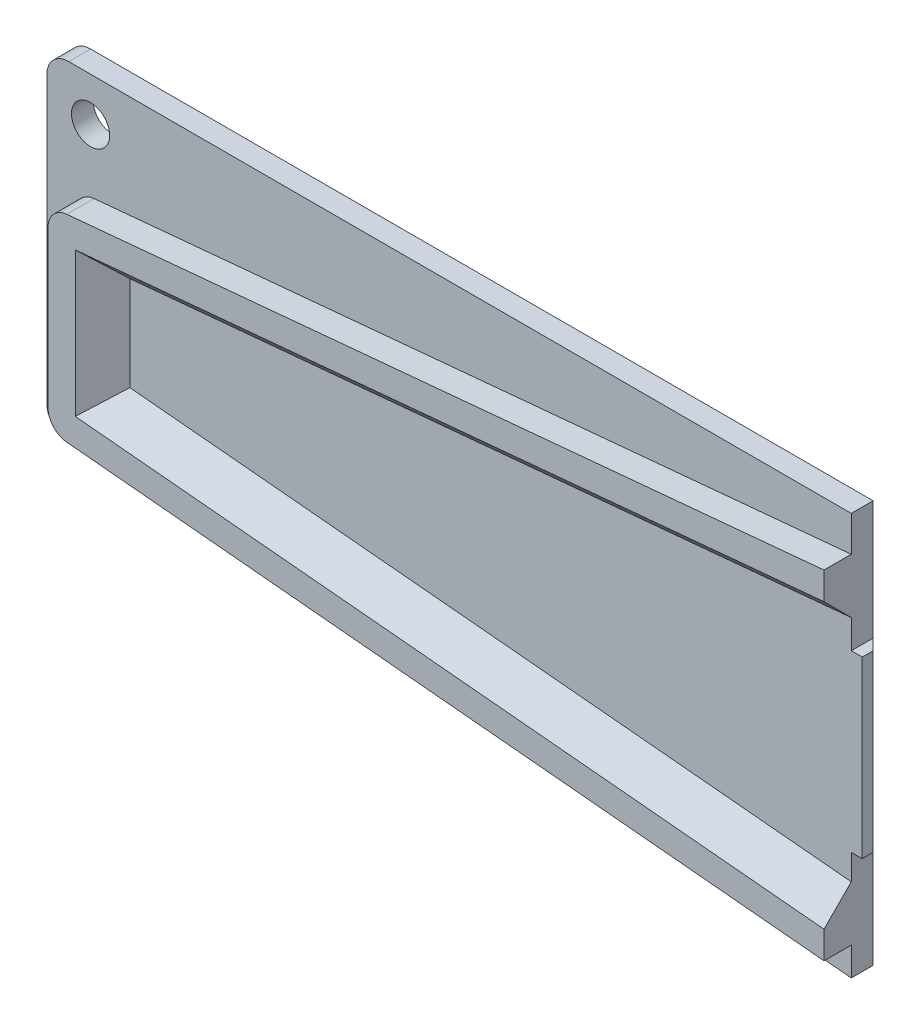
ISO-10303-21;
HEADER;
FILE_DESCRIPTION(('STEP AP214'),'2;1');
FILE_NAME('part.step','',(''),(''),'','','');
FILE_SCHEMA(('AUTOMOTIVE_DESIGN { 1 0 10303 214 1 1 1 1 }'));
ENDSEC;
DATA;
#1=APPLICATION_CONTEXT('core data for automotive mechanical design processes');
#2=APPLICATION_PROTOCOL_DEFINITION('international standard','automotive_design',2000,#1);
#3=PRODUCT_CONTEXT('',#1,'mechanical');
#4=PRODUCT('Part','Part','',(#3));
#5=PRODUCT_RELATED_PRODUCT_CATEGORY('part','',(#4));
#6=PRODUCT_DEFINITION_FORMATION('','',#4);
#7=PRODUCT_DEFINITION_CONTEXT('part definition',#1,'design');
#8=PRODUCT_DEFINITION('design','',#6,#7);
#9=PRODUCT_DEFINITION_SHAPE('','',#8);
#10=(LENGTH_UNIT() NAMED_UNIT(*) SI_UNIT(.MILLI.,.METRE.));
#11=(NAMED_UNIT(*) PLANE_ANGLE_UNIT() SI_UNIT($,.RADIAN.));
#12=(NAMED_UNIT(*) SI_UNIT($,.STERADIAN.) SOLID_ANGLE_UNIT());
#13=UNCERTAINTY_MEASURE_WITH_UNIT(LENGTH_MEASURE(1.E-05),#10,'distance_accuracy_value','');
#14=(GEOMETRIC_REPRESENTATION_CONTEXT(3) GLOBAL_UNCERTAINTY_ASSIGNED_CONTEXT((#13)) GLOBAL_UNIT_ASSIGNED_CONTEXT((#10,
#11,#12)) REPRESENTATION_CONTEXT('',''));
#15=CARTESIAN_POINT('',(0.,0.,0.));
#16=DIRECTION('',(0.,0.,1.));
#17=DIRECTION('',(1.,0.,0.));
#18=AXIS2_PLACEMENT_3D('',#15,#16,#17);
#19=CARTESIAN_POINT('',(-114.701591379437,-27.1776995517147,0.));
#20=DIRECTION('',(0.,0.,-1.));
#21=DIRECTION('',(1.,0.,0.));
#22=AXIS2_PLACEMENT_3D('',#19,#20,#21);
#23=PLANE('',#22);
#24=DIRECTION('',(0.,1.,0.));
#25=VECTOR('',#24,1.);
#26=CARTESIAN_POINT('',(-43.,-35.8676482876294,0.));
#27=LINE('',#26,#25);
#28=CARTESIAN_POINT('',(-43.,-28.2347247659633,0.));
#29=VERTEX_POINT('',#28);
#30=CARTESIAN_POINT('',(-43.0000000000001,-25.8996605862736,0.));
#31=VERTEX_POINT('',#30);
#32=EDGE_CURVE('E245',#29,#31,#27,.T.);
#33=ORIENTED_EDGE('',*,*,#32,.T.);
#34=DIRECTION('',(1.,0.,0.));
#35=VECTOR('',#34,1.);
#36=CARTESIAN_POINT('',(-43.0000000000001,-25.8996605862736,0.));
#37=LINE('',#36,#35);
#38=CARTESIAN_POINT('',(-42.,-25.8996605862736,0.));
#39=VERTEX_POINT('',#38);
#40=EDGE_CURVE('E411',#31,#39,#37,.T.);
#41=ORIENTED_EDGE('',*,*,#40,.T.);
#42=DIRECTION('',(0.,1.,0.));
#43=VECTOR('',#42,1.);
#44=CARTESIAN_POINT('',(-42.,-25.8996605862736,0.));
#45=LINE('',#44,#43);
#46=CARTESIAN_POINT('',(-42.0000000000001,-9.89966058627359,0.));
#47=VERTEX_POINT('',#46);
#48=EDGE_CURVE('E435',#39,#47,#45,.T.);
#49=ORIENTED_EDGE('',*,*,#48,.T.);
#50=DIRECTION('',(1.,0.,0.));
#51=VECTOR('',#50,1.);
#52=CARTESIAN_POINT('',(-43.0000000000001,-9.89966058627359,0.));
#53=LINE('',#52,#51);
#54=CARTESIAN_POINT('',(-43.,-9.89966058627359,0.));
#55=VERTEX_POINT('',#54);
#56=EDGE_CURVE('E388',#55,#47,#53,.T.);
#57=ORIENTED_EDGE('',*,*,#56,.F.);
#58=CARTESIAN_POINT('',(-43.,-7.26527523403666,0.));
#59=VERTEX_POINT('',#58);
#60=EDGE_CURVE('E250',#55,#59,#27,.T.);
#61=ORIENTED_EDGE('',*,*,#60,.T.);
#62=DIRECTION('',(0.995686643319218,0.0927798917638361,0.));
#63=VECTOR('',#62,1.);
#64=CARTESIAN_POINT('',(-42.7680502705904,-7.2436617365235,0.));
#65=LINE('',#64,#63);
#66=CARTESIAN_POINT('',(-109.100916052008,-13.4246787752465,0.));
#67=VERTEX_POINT('',#66);
#68=EDGE_CURVE('E251',#67,#59,#65,.T.);
#69=ORIENTED_EDGE('',*,*,#68,.F.);
#70=DIRECTION('',(0.,1.,0.));
#71=VECTOR('',#70,1.);
#72=CARTESIAN_POINT('',(-109.100916052008,-11.1468032148899,0.));
#73=LINE('',#72,#71);
#74=CARTESIAN_POINT('',(-109.100916052008,-22.0753212247535,0.));
#75=VERTEX_POINT('',#74);
#76=EDGE_CURVE('E313',#75,#67,#73,.T.);
#77=ORIENTED_EDGE('',*,*,#76,.F.);
#78=DIRECTION('',(-0.995686643319218,0.0927798917638361,0.));
#79=VECTOR('',#78,1.);
#80=CARTESIAN_POINT('',(-111.368966322599,-21.8639801768121,0.));
#81=LINE('',#80,#79);
#82=EDGE_CURVE('E316',#29,#75,#81,.T.);
#83=ORIENTED_EDGE('',*,*,#82,.F.);
#84=EDGE_LOOP('',(#33,#41,#49,#57,#61,#69,#77,#83));
#85=FACE_BOUND('',#84,.T.);
#86=ADVANCED_FACE('F35',(#85),#23,.F.);
#87=CARTESIAN_POINT('',(-112.701591379437,-3.00000000000001,0.));
#88=DIRECTION('',(0.,0.,-1.));
#89=DIRECTION('',(-1.,0.,0.));
#90=AXIS2_PLACEMENT_3D('',#87,#88,#89);
#91=CIRCLE('',#90,1.75);
#92=CARTESIAN_POINT('',(-114.451591379437,-3.00000000000001,0.));
#93=VERTEX_POINT('',#92);
#94=EDGE_CURVE('E205',#93,#93,#91,.T.);
#95=ORIENTED_EDGE('',*,*,#94,.T.);
#96=EDGE_LOOP('',(#95));
#97=FACE_BOUND('',#96,.T.);
#98=DIRECTION('',(-0.995686643319218,0.092779891763836,0.));
#99=VECTOR('',#98,1.);
#100=CARTESIAN_POINT('',(-43.,-33.2563849775857,0.));
#101=LINE('',#100,#99);
#102=CARTESIAN_POINT('',(-43.,-33.2563849775857,0.));
#103=VERTEX_POINT('',#102);
#104=CARTESIAN_POINT('',(-112.37719784636,-26.7916915419022,0.));
#105=VERTEX_POINT('',#104);
#106=EDGE_CURVE('E199',#103,#105,#101,.T.);
#107=ORIENTED_EDGE('',*,*,#106,.T.);
#108=CARTESIAN_POINT('',(-112.200916052008,-24.8998869195957,0.));
#109=DIRECTION('',(0.,0.,-1.));
#110=DIRECTION('',(-1.,0.,0.));
#111=AXIS2_PLACEMENT_3D('',#108,#109,#110);
#112=CIRCLE('',#111,1.9);
#113=CARTESIAN_POINT('',(-114.100916052008,-24.8998869195957,0.));
#114=VERTEX_POINT('',#113);
#115=EDGE_CURVE('E224',#105,#114,#112,.T.);
#116=ORIENTED_EDGE('',*,*,#115,.T.);
#117=DIRECTION('',(0.,1.,0.));
#118=VECTOR('',#117,1.);
#119=CARTESIAN_POINT('',(-114.100916052008,-24.8998869195957,0.));
#120=LINE('',#119,#118);
#121=CARTESIAN_POINT('',(-114.100916052008,-10.6001130804043,0.));
#122=VERTEX_POINT('',#121);
#123=EDGE_CURVE('E190',#114,#122,#120,.T.);
#124=ORIENTED_EDGE('',*,*,#123,.T.);
#125=CARTESIAN_POINT('',(-112.200916052008,-10.6001130804043,0.));
#126=DIRECTION('',(0.,0.,-1.));
#127=DIRECTION('',(-1.,0.,0.));
#128=AXIS2_PLACEMENT_3D('',#125,#126,#127);
#129=CIRCLE('',#128,1.9);
#130=CARTESIAN_POINT('',(-112.37719784636,-8.70830845809778,0.));
#131=VERTEX_POINT('',#130);
#132=EDGE_CURVE('E227',#122,#131,#129,.T.);
#133=ORIENTED_EDGE('',*,*,#132,.T.);
#134=DIRECTION('',(0.995686643319218,0.0927798917638362,0.));
#135=VECTOR('',#134,1.);
#136=CARTESIAN_POINT('',(-112.37719784636,-8.70830845809778,0.));
#137=LINE('',#136,#135);
#138=CARTESIAN_POINT('',(-43.,-2.24361502241426,0.));
#139=VERTEX_POINT('',#138);
#140=EDGE_CURVE('E202',#131,#139,#137,.T.);
#141=ORIENTED_EDGE('',*,*,#140,.T.);
#142=CARTESIAN_POINT('',(-43.,1.,0.));
#143=VERTEX_POINT('',#142);
#144=EDGE_CURVE('E268',#139,#143,#27,.T.);
#145=ORIENTED_EDGE('',*,*,#144,.T.);
#146=DIRECTION('',(-1.,0.,0.));
#147=VECTOR('',#146,1.);
#148=CARTESIAN_POINT('',(-43.,1.,0.));
#149=LINE('',#148,#147);
#150=CARTESIAN_POINT('',(-114.701591379437,0.999999999999987,0.));
#151=VERTEX_POINT('',#150);
#152=EDGE_CURVE('E258',#143,#151,#149,.T.);
#153=ORIENTED_EDGE('',*,*,#152,.T.);
#154=CARTESIAN_POINT('',(-114.701591379437,-1.00000000000001,0.));
#155=DIRECTION('',(0.,0.,1.));
#156=DIRECTION('',(1.,0.,0.));
#157=AXIS2_PLACEMENT_3D('',#154,#155,#156);
#158=CIRCLE('',#157,2.);
#159=CARTESIAN_POINT('',(-116.701591379437,-1.00000000000001,0.));
#160=VERTEX_POINT('',#159);
#161=EDGE_CURVE('E289',#151,#160,#158,.T.);
#162=ORIENTED_EDGE('',*,*,#161,.T.);
#163=DIRECTION('',(0.,-1.,0.));
#164=VECTOR('',#163,1.);
#165=CARTESIAN_POINT('',(-116.701591379437,-4.67769955171465,0.));
#166=LINE('',#165,#164);
#167=CARTESIAN_POINT('',(-116.701591379437,-27.1776995517147,0.));
#168=VERTEX_POINT('',#167);
#169=EDGE_CURVE('E292',#160,#168,#166,.T.);
#170=ORIENTED_EDGE('',*,*,#169,.T.);
#171=CARTESIAN_POINT('',(-114.701591379437,-27.1776995517147,0.));
#172=DIRECTION('',(0.,0.,1.));
#173=DIRECTION('',(1.,0.,0.));
#174=AXIS2_PLACEMENT_3D('',#171,#172,#173);
#175=CIRCLE('',#174,2.00000000000001);
#176=CARTESIAN_POINT('',(-114.887151162965,-29.1690728383531,0.));
#177=VERTEX_POINT('',#176);
#178=EDGE_CURVE('E437',#168,#177,#175,.T.);
#179=ORIENTED_EDGE('',*,*,#178,.T.);
#180=DIRECTION('',(0.995686643319217,-0.0927798917638361,0.));
#181=VECTOR('',#180,1.);
#182=CARTESIAN_POINT('',(-114.887151162965,-29.1690728383531,0.));
#183=LINE('',#182,#181);
#184=CARTESIAN_POINT('',(-43.,-35.8676482876294,0.));
#185=VERTEX_POINT('',#184);
#186=EDGE_CURVE('E256',#177,#185,#183,.T.);
#187=ORIENTED_EDGE('',*,*,#186,.T.);
#188=EDGE_CURVE('E249',#185,#103,#27,.T.);
#189=ORIENTED_EDGE('',*,*,#188,.T.);
#190=EDGE_LOOP('',(#107,#116,#124,#133,#141,#145,#153,#162,#170,#179,#187,#189));
#191=FACE_BOUND('',#190,.T.);
#192=ADVANCED_FACE('F283',(#97,#191),#23,.F.);
#193=CARTESIAN_POINT('',(-43.,-35.8676482876294,-2.));
#194=DIRECTION('',(-1.,0.,0.));
#195=DIRECTION('',(0.,0.,-1.));
#196=AXIS2_PLACEMENT_3D('',#193,#194,#195);
#197=PLANE('',#196);
#198=DIRECTION('',(0.,0.,1.));
#199=VECTOR('',#198,1.);
#200=CARTESIAN_POINT('',(-43.,-25.8996605862736,-2.));
#201=LINE('',#200,#199);
#202=CARTESIAN_POINT('',(-43.,-25.8996605862736,-2.));
#203=VERTEX_POINT('',#202);
#204=EDGE_CURVE('E408',#203,#31,#201,.T.);
#205=ORIENTED_EDGE('',*,*,#204,.T.);
#206=ORIENTED_EDGE('',*,*,#32,.F.);
#207=DIRECTION('',(0.,-0.708633423963613,0.705576835250142));
#208=VECTOR('',#207,1.);
#209=CARTESIAN_POINT('',(-43.,-31.0676931327552,2.82074876376061));
#210=LINE('',#209,#208);
#211=CARTESIAN_POINT('',(-43.,-30.7455548717745,2.5));
#212=VERTEX_POINT('',#211);
#213=EDGE_CURVE('E44',#212,#29,#210,.F.);
#214=ORIENTED_EDGE('',*,*,#213,.F.);
#215=DIRECTION('',(0.,-1.,0.));
#216=VECTOR('',#215,1.);
#217=CARTESIAN_POINT('',(-43.,-30.7455548717745,2.5));
#218=LINE('',#217,#216);
#219=CARTESIAN_POINT('',(-43.,-33.2563849775857,2.5));
#220=VERTEX_POINT('',#219);
#221=EDGE_CURVE('E219',#212,#220,#218,.T.);
#222=ORIENTED_EDGE('',*,*,#221,.T.);
#223=DIRECTION('',(0.,0.,-1.));
#224=VECTOR('',#223,1.);
#225=CARTESIAN_POINT('',(-43.,-33.2563849775857,2.5));
#226=LINE('',#225,#224);
#227=EDGE_CURVE('E242',#220,#103,#226,.T.);
#228=ORIENTED_EDGE('',*,*,#227,.T.);
#229=ORIENTED_EDGE('',*,*,#188,.F.);
#230=DIRECTION('',(0.,0.,1.));
#231=VECTOR('',#230,1.);
#232=CARTESIAN_POINT('',(-43.,-35.8676482876294,-2.));
#233=LINE('',#232,#231);
#234=CARTESIAN_POINT('',(-43.,-35.8676482876294,-2.));
#235=VERTEX_POINT('',#234);
#236=EDGE_CURVE('E305',#235,#185,#233,.T.);
#237=ORIENTED_EDGE('',*,*,#236,.F.);
#238=DIRECTION('',(0.,1.,0.));
#239=VECTOR('',#238,1.);
#240=CARTESIAN_POINT('',(-43.,-35.8676482876294,-2.));
#241=LINE('',#240,#239);
#242=EDGE_CURVE('E451',#235,#203,#241,.T.);
#243=ORIENTED_EDGE('',*,*,#242,.T.);
#244=EDGE_LOOP('',(#205,#206,#214,#222,#228,#229,#237,#243));
#245=FACE_BOUND('',#244,.T.);
#246=ADVANCED_FACE('F346',(#245),#197,.F.);
#247=CARTESIAN_POINT('',(-114.701591379437,-27.1776995517147,-2.));
#248=DIRECTION('',(0.,0.,1.));
#249=DIRECTION('',(-1.,0.,0.));
#250=AXIS2_PLACEMENT_3D('',#247,#248,#249);
#251=CYLINDRICAL_SURFACE('',#250,2.00000000000001);
#252=ORIENTED_EDGE('',*,*,#178,.F.);
#253=DIRECTION('',(0.,0.,1.));
#254=VECTOR('',#253,1.);
#255=CARTESIAN_POINT('',(-116.701591379437,-27.1776995517147,-2.));
#256=LINE('',#255,#254);
#257=CARTESIAN_POINT('',(-116.701591379437,-27.1776995517147,-2.));
#258=VERTEX_POINT('',#257);
#259=EDGE_CURVE('E308',#258,#168,#256,.T.);
#260=ORIENTED_EDGE('',*,*,#259,.F.);
#261=CARTESIAN_POINT('',(-114.701591379437,-27.1776995517147,-2.));
#262=DIRECTION('',(0.,0.,1.));
#263=DIRECTION('',(1.,0.,0.));
#264=AXIS2_PLACEMENT_3D('',#261,#262,#263);
#265=CIRCLE('',#264,2.00000000000001);
#266=CARTESIAN_POINT('',(-114.887151162965,-29.1690728383531,-2.));
#267=VERTEX_POINT('',#266);
#268=EDGE_CURVE('E439',#258,#267,#265,.T.);
#269=ORIENTED_EDGE('',*,*,#268,.T.);
#270=DIRECTION('',(0.,0.,1.));
#271=VECTOR('',#270,1.);
#272=CARTESIAN_POINT('',(-114.887151162965,-29.1690728383531,-2.));
#273=LINE('',#272,#271);
#274=EDGE_CURVE('E307',#267,#177,#273,.T.);
#275=ORIENTED_EDGE('',*,*,#274,.T.);
#276=EDGE_LOOP('',(#252,#260,#269,#275));
#277=FACE_BOUND('',#276,.T.);
#278=ADVANCED_FACE('F369',(#277),#251,.T.);
#279=CARTESIAN_POINT('',(-114.887151162965,-29.1690728383531,-2.));
#280=DIRECTION('',(0.0927798917638361,0.995686643319218,0.));
#281=DIRECTION('',(-0.995686643319218,0.0927798917638361,0.));
#282=AXIS2_PLACEMENT_3D('',#279,#280,#281);
#283=PLANE('',#282);
#284=ORIENTED_EDGE('',*,*,#186,.F.);
#285=ORIENTED_EDGE('',*,*,#274,.F.);
#286=DIRECTION('',(0.995686643319217,-0.0927798917638361,0.));
#287=VECTOR('',#286,1.);
#288=CARTESIAN_POINT('',(-114.887151162965,-29.1690728383531,-2.));
#289=LINE('',#288,#287);
#290=EDGE_CURVE('E442',#267,#235,#289,.T.);
#291=ORIENTED_EDGE('',*,*,#290,.T.);
#292=ORIENTED_EDGE('',*,*,#236,.T.);
#293=EDGE_LOOP('',(#284,#285,#291,#292));
#294=FACE_BOUND('',#293,.T.);
#295=ADVANCED_FACE('F365',(#294),#283,.F.);
#296=CARTESIAN_POINT('',(-43.,-9.89966058627359,-2.));
#297=VERTEX_POINT('',#296);
#298=CARTESIAN_POINT('',(-43.,1.,-2.));
#299=VERTEX_POINT('',#298);
#300=EDGE_CURVE('E444',#297,#299,#241,.T.);
#301=ORIENTED_EDGE('',*,*,#300,.T.);
#302=DIRECTION('',(0.,0.,1.));
#303=VECTOR('',#302,1.);
#304=CARTESIAN_POINT('',(-43.,1.,-2.));
#305=LINE('',#304,#303);
#306=EDGE_CURVE('E303',#299,#143,#305,.T.);
#307=ORIENTED_EDGE('',*,*,#306,.T.);
#308=ORIENTED_EDGE('',*,*,#144,.F.);
#309=DIRECTION('',(0.,0.,-1.));
#310=VECTOR('',#309,1.);
#311=CARTESIAN_POINT('',(-43.,-2.24361502241427,2.5));
#312=LINE('',#311,#310);
#313=CARTESIAN_POINT('',(-43.,-2.24361502241427,2.5));
#314=VERTEX_POINT('',#313);
#315=EDGE_CURVE('E239',#314,#139,#312,.T.);
#316=ORIENTED_EDGE('',*,*,#315,.F.);
#317=DIRECTION('',(0.,-1.,0.));
#318=VECTOR('',#317,1.);
#319=CARTESIAN_POINT('',(-43.,-2.24361502241427,2.5));
#320=LINE('',#319,#318);
#321=CARTESIAN_POINT('',(-43.,-4.75444512822548,2.5));
#322=VERTEX_POINT('',#321);
#323=EDGE_CURVE('E210',#314,#322,#320,.T.);
#324=ORIENTED_EDGE('',*,*,#323,.T.);
#325=DIRECTION('',(0.,-0.708633423963612,-0.705576835250143));
#326=VECTOR('',#325,1.);
#327=CARTESIAN_POINT('',(-43.,-22.6282715724193,-15.2967302554899));
#328=LINE('',#327,#326);
#329=EDGE_CURVE('E11',#59,#322,#328,.F.);
#330=ORIENTED_EDGE('',*,*,#329,.F.);
#331=ORIENTED_EDGE('',*,*,#60,.F.);
#332=DIRECTION('',(0.,0.,1.));
#333=VECTOR('',#332,1.);
#334=CARTESIAN_POINT('',(-43.0000000000001,-9.89966058627359,-2.));
#335=LINE('',#334,#333);
#336=EDGE_CURVE('E194',#297,#55,#335,.T.);
#337=ORIENTED_EDGE('',*,*,#336,.F.);
#338=EDGE_LOOP('',(#301,#307,#308,#316,#324,#330,#331,#337));
#339=FACE_BOUND('',#338,.T.);
#340=ADVANCED_FACE('F361',(#339),#197,.F.);
#341=CARTESIAN_POINT('',(-43.,1.,-2.));
#342=DIRECTION('',(0.,-1.,0.));
#343=DIRECTION('',(1.,0.,0.));
#344=AXIS2_PLACEMENT_3D('',#341,#342,#343);
#345=PLANE('',#344);
#346=ORIENTED_EDGE('',*,*,#152,.F.);
#347=ORIENTED_EDGE('',*,*,#306,.F.);
#348=DIRECTION('',(-1.,0.,0.));
#349=VECTOR('',#348,1.);
#350=CARTESIAN_POINT('',(-43.,1.,-2.));
#351=LINE('',#350,#349);
#352=CARTESIAN_POINT('',(-114.701591379437,0.999999999999987,-2.));
#353=VERTEX_POINT('',#352);
#354=EDGE_CURVE('E447',#299,#353,#351,.T.);
#355=ORIENTED_EDGE('',*,*,#354,.T.);
#356=DIRECTION('',(0.,0.,1.));
#357=VECTOR('',#356,1.);
#358=CARTESIAN_POINT('',(-114.701591379437,0.999999999999987,-2.));
#359=LINE('',#358,#357);
#360=EDGE_CURVE('E300',#353,#151,#359,.T.);
#361=ORIENTED_EDGE('',*,*,#360,.T.);
#362=EDGE_LOOP('',(#346,#347,#355,#361));
#363=FACE_BOUND('',#362,.T.);
#364=ADVANCED_FACE('F357',(#363),#345,.F.);
#365=CARTESIAN_POINT('',(-114.701591379437,-1.00000000000001,-2.));
#366=DIRECTION('',(0.,0.,1.));
#367=DIRECTION('',(-1.,0.,0.));
#368=AXIS2_PLACEMENT_3D('',#365,#366,#367);
#369=CYLINDRICAL_SURFACE('',#368,2.);
#370=ORIENTED_EDGE('',*,*,#161,.F.);
#371=ORIENTED_EDGE('',*,*,#360,.F.);
#372=CARTESIAN_POINT('',(-114.701591379437,-1.00000000000001,-2.));
#373=DIRECTION('',(0.,0.,1.));
#374=DIRECTION('',(1.,0.,0.));
#375=AXIS2_PLACEMENT_3D('',#372,#373,#374);
#376=CIRCLE('',#375,2.);
#377=CARTESIAN_POINT('',(-116.701591379437,-1.00000000000001,-2.));
#378=VERTEX_POINT('',#377);
#379=EDGE_CURVE('E301',#353,#378,#376,.T.);
#380=ORIENTED_EDGE('',*,*,#379,.T.);
#381=DIRECTION('',(0.,0.,1.));
#382=VECTOR('',#381,1.);
#383=CARTESIAN_POINT('',(-116.701591379437,-1.00000000000001,-2.));
#384=LINE('',#383,#382);
#385=EDGE_CURVE('E298',#378,#160,#384,.T.);
#386=ORIENTED_EDGE('',*,*,#385,.T.);
#387=EDGE_LOOP('',(#370,#371,#380,#386));
#388=FACE_BOUND('',#387,.T.);
#389=ADVANCED_FACE('F354',(#388),#369,.T.);
#390=CARTESIAN_POINT('',(-116.701591379437,-4.67769955171465,-2.));
#391=DIRECTION('',(1.,0.,0.));
#392=DIRECTION('',(0.,0.,1.));
#393=AXIS2_PLACEMENT_3D('',#390,#391,#392);
#394=PLANE('',#393);
#395=ORIENTED_EDGE('',*,*,#169,.F.);
#396=ORIENTED_EDGE('',*,*,#385,.F.);
#397=DIRECTION('',(0.,-1.,0.));
#398=VECTOR('',#397,1.);
#399=CARTESIAN_POINT('',(-116.701591379437,-4.67769955171465,-2.));
#400=LINE('',#399,#398);
#401=EDGE_CURVE('E295',#378,#258,#400,.T.);
#402=ORIENTED_EDGE('',*,*,#401,.T.);
#403=ORIENTED_EDGE('',*,*,#259,.T.);
#404=EDGE_LOOP('',(#395,#396,#402,#403));
#405=FACE_BOUND('',#404,.T.);
#406=ADVANCED_FACE('F351',(#405),#394,.F.);
#407=CARTESIAN_POINT('',(-114.701591379437,-27.1776995517147,-2.));
#408=DIRECTION('',(0.,0.,-1.));
#409=DIRECTION('',(1.,0.,0.));
#410=AXIS2_PLACEMENT_3D('',#407,#408,#409);
#411=PLANE('',#410);
#412=CARTESIAN_POINT('',(-112.701591379437,-3.00000000000001,-2.));
#413=DIRECTION('',(0.,0.,1.));
#414=DIRECTION('',(1.,0.,0.));
#415=AXIS2_PLACEMENT_3D('',#412,#413,#414);
#416=CIRCLE('',#415,1.75);
#417=CARTESIAN_POINT('',(-110.951591379437,-3.00000000000001,-2.));
#418=VERTEX_POINT('',#417);
#419=EDGE_CURVE('E39',#418,#418,#416,.T.);
#420=ORIENTED_EDGE('',*,*,#419,.T.);
#421=EDGE_LOOP('',(#420));
#422=FACE_BOUND('',#421,.T.);
#423=ORIENTED_EDGE('',*,*,#401,.F.);
#424=ORIENTED_EDGE('',*,*,#379,.F.);
#425=ORIENTED_EDGE('',*,*,#354,.F.);
#426=ORIENTED_EDGE('',*,*,#300,.F.);
#427=DIRECTION('',(0.,1.,0.));
#428=VECTOR('',#427,1.);
#429=CARTESIAN_POINT('',(-43.,-25.8996605862736,-2.));
#430=LINE('',#429,#428);
#431=EDGE_CURVE('E417',#203,#297,#430,.T.);
#432=ORIENTED_EDGE('',*,*,#431,.F.);
#433=ORIENTED_EDGE('',*,*,#242,.F.);
#434=ORIENTED_EDGE('',*,*,#290,.F.);
#435=ORIENTED_EDGE('',*,*,#268,.F.);
#436=EDGE_LOOP('',(#423,#424,#425,#426,#432,#433,#434,#435));
#437=FACE_BOUND('',#436,.T.);
#438=ADVANCED_FACE('F349',(#422,#437),#411,.T.);
#439=CARTESIAN_POINT('',(-42.,-25.8996605862736,-1.));
#440=DIRECTION('',(-1.,0.,0.));
#441=DIRECTION('',(0.,-1.,0.));
#442=AXIS2_PLACEMENT_3D('',#439,#440,#441);
#443=PLANE('',#442);
#444=DIRECTION('',(0.,0.,-1.));
#445=VECTOR('',#444,1.);
#446=CARTESIAN_POINT('',(-42.0000000000001,-9.89966058627359,-1.));
#447=LINE('',#446,#445);
#448=CARTESIAN_POINT('',(-42.0000000000001,-9.89966058627359,-1.));
#449=VERTEX_POINT('',#448);
#450=EDGE_CURVE('E426',#47,#449,#447,.T.);
#451=ORIENTED_EDGE('',*,*,#450,.F.);
#452=ORIENTED_EDGE('',*,*,#48,.F.);
#453=DIRECTION('',(0.,0.,-1.));
#454=VECTOR('',#453,1.);
#455=CARTESIAN_POINT('',(-42.,-25.8996605862736,-1.));
#456=LINE('',#455,#454);
#457=CARTESIAN_POINT('',(-42.,-25.8996605862736,-1.));
#458=VERTEX_POINT('',#457);
#459=EDGE_CURVE('E405',#39,#458,#456,.T.);
#460=ORIENTED_EDGE('',*,*,#459,.T.);
#461=DIRECTION('',(0.,1.,0.));
#462=VECTOR('',#461,1.);
#463=CARTESIAN_POINT('',(-42.,-25.8996605862736,-1.));
#464=LINE('',#463,#462);
#465=EDGE_CURVE('E422',#458,#449,#464,.T.);
#466=ORIENTED_EDGE('',*,*,#465,.T.);
#467=EDGE_LOOP('',(#451,#452,#460,#466));
#468=FACE_BOUND('',#467,.T.);
#469=ADVANCED_FACE('F500',(#468),#443,.F.);
#470=CARTESIAN_POINT('',(-42.,-25.8996605862736,-1.));
#471=DIRECTION('',(-0.707106781186547,0.,0.707106781186548));
#472=DIRECTION('',(-0.707106781186548,0.,-0.707106781186547));
#473=AXIS2_PLACEMENT_3D('',#470,#471,#472);
#474=PLANE('',#473);
#475=DIRECTION('',(-0.707106781186548,0.,-0.707106781186547));
#476=VECTOR('',#475,1.);
#477=CARTESIAN_POINT('',(-42.0000000000001,-9.89966058627359,-1.));
#478=LINE('',#477,#476);
#479=EDGE_CURVE('E412',#449,#297,#478,.T.);
#480=ORIENTED_EDGE('',*,*,#479,.F.);
#481=ORIENTED_EDGE('',*,*,#465,.F.);
#482=DIRECTION('',(-0.707106781186548,0.,-0.707106781186547));
#483=VECTOR('',#482,1.);
#484=CARTESIAN_POINT('',(-42.,-25.8996605862736,-1.));
#485=LINE('',#484,#483);
#486=EDGE_CURVE('E415',#458,#203,#485,.T.);
#487=ORIENTED_EDGE('',*,*,#486,.T.);
#488=ORIENTED_EDGE('',*,*,#431,.T.);
#489=EDGE_LOOP('',(#480,#481,#487,#488));
#490=FACE_BOUND('',#489,.T.);
#491=ADVANCED_FACE('F506',(#490),#474,.F.);
#492=CARTESIAN_POINT('',(0.,-25.8996605862734,0.));
#493=DIRECTION('',(0.,-1.,0.));
#494=DIRECTION('',(1.,0.,0.));
#495=AXIS2_PLACEMENT_3D('',#492,#493,#494);
#496=PLANE('',#495);
#497=ORIENTED_EDGE('',*,*,#204,.F.);
#498=ORIENTED_EDGE('',*,*,#486,.F.);
#499=ORIENTED_EDGE('',*,*,#459,.F.);
#500=ORIENTED_EDGE('',*,*,#40,.F.);
#501=EDGE_LOOP('',(#497,#498,#499,#500));
#502=FACE_BOUND('',#501,.T.);
#503=ADVANCED_FACE('F513',(#502),#496,.T.);
#504=CARTESIAN_POINT('',(0.,-9.89966058627344,0.));
#505=DIRECTION('',(0.,-1.,0.));
#506=DIRECTION('',(1.,0.,0.));
#507=AXIS2_PLACEMENT_3D('',#504,#505,#506);
#508=PLANE('',#507);
#509=ORIENTED_EDGE('',*,*,#336,.T.);
#510=ORIENTED_EDGE('',*,*,#56,.T.);
#511=ORIENTED_EDGE('',*,*,#450,.T.);
#512=ORIENTED_EDGE('',*,*,#479,.T.);
#513=EDGE_LOOP('',(#509,#510,#511,#512));
#514=FACE_BOUND('',#513,.T.);
#515=ADVANCED_FACE('F521',(#514),#508,.F.);
#516=CARTESIAN_POINT('',(-112.200916052008,-24.8998869195957,2.5));
#517=DIRECTION('',(0.,0.,-1.));
#518=DIRECTION('',(1.,0.,0.));
#519=AXIS2_PLACEMENT_3D('',#516,#517,#518);
#520=CYLINDRICAL_SURFACE('',#519,1.9);
#521=ORIENTED_EDGE('',*,*,#115,.F.);
#522=DIRECTION('',(0.,0.,-1.));
#523=VECTOR('',#522,1.);
#524=CARTESIAN_POINT('',(-112.37719784636,-26.7916915419022,2.5));
#525=LINE('',#524,#523);
#526=CARTESIAN_POINT('',(-112.37719784636,-26.7916915419022,2.5));
#527=VERTEX_POINT('',#526);
#528=EDGE_CURVE('E198',#527,#105,#525,.T.);
#529=ORIENTED_EDGE('',*,*,#528,.F.);
#530=CARTESIAN_POINT('',(-112.200916052008,-24.8998869195957,2.5));
#531=DIRECTION('',(0.,0.,-1.));
#532=DIRECTION('',(-1.,0.,0.));
#533=AXIS2_PLACEMENT_3D('',#530,#531,#532);
#534=CIRCLE('',#533,1.9);
#535=CARTESIAN_POINT('',(-114.100916052008,-24.8998869195957,2.5));
#536=VERTEX_POINT('',#535);
#537=EDGE_CURVE('E179',#527,#536,#534,.T.);
#538=ORIENTED_EDGE('',*,*,#537,.T.);
#539=DIRECTION('',(0.,0.,-1.));
#540=VECTOR('',#539,1.);
#541=CARTESIAN_POINT('',(-114.100916052008,-24.8998869195957,2.5));
#542=LINE('',#541,#540);
#543=EDGE_CURVE('E187',#536,#114,#542,.T.);
#544=ORIENTED_EDGE('',*,*,#543,.T.);
#545=EDGE_LOOP('',(#521,#529,#538,#544));
#546=FACE_BOUND('',#545,.T.);
#547=ADVANCED_FACE('F197',(#546),#520,.T.);
#548=CARTESIAN_POINT('',(-114.100916052008,-24.8998869195957,2.5));
#549=DIRECTION('',(1.,0.,0.));
#550=DIRECTION('',(0.,0.,1.));
#551=AXIS2_PLACEMENT_3D('',#548,#549,#550);
#552=PLANE('',#551);
#553=ORIENTED_EDGE('',*,*,#123,.F.);
#554=ORIENTED_EDGE('',*,*,#543,.F.);
#555=DIRECTION('',(0.,1.,0.));
#556=VECTOR('',#555,1.);
#557=CARTESIAN_POINT('',(-114.100916052008,-24.8998869195957,2.5));
#558=LINE('',#557,#556);
#559=CARTESIAN_POINT('',(-114.100916052008,-10.6001130804043,2.5));
#560=VERTEX_POINT('',#559);
#561=EDGE_CURVE('E175',#536,#560,#558,.T.);
#562=ORIENTED_EDGE('',*,*,#561,.T.);
#563=DIRECTION('',(0.,0.,-1.));
#564=VECTOR('',#563,1.);
#565=CARTESIAN_POINT('',(-114.100916052008,-10.6001130804043,2.5));
#566=LINE('',#565,#564);
#567=EDGE_CURVE('E195',#560,#122,#566,.T.);
#568=ORIENTED_EDGE('',*,*,#567,.T.);
#569=EDGE_LOOP('',(#553,#554,#562,#568));
#570=FACE_BOUND('',#569,.T.);
#571=ADVANCED_FACE('F188',(#570),#552,.F.);
#572=CARTESIAN_POINT('',(-112.200916052008,-10.6001130804043,2.5));
#573=DIRECTION('',(0.,0.,-1.));
#574=DIRECTION('',(1.,0.,0.));
#575=AXIS2_PLACEMENT_3D('',#572,#573,#574);
#576=CYLINDRICAL_SURFACE('',#575,1.9);
#577=ORIENTED_EDGE('',*,*,#132,.F.);
#578=ORIENTED_EDGE('',*,*,#567,.F.);
#579=CARTESIAN_POINT('',(-112.200916052008,-10.6001130804043,2.5));
#580=DIRECTION('',(0.,0.,-1.));
#581=DIRECTION('',(-1.,0.,0.));
#582=AXIS2_PLACEMENT_3D('',#579,#580,#581);
#583=CIRCLE('',#582,1.9);
#584=CARTESIAN_POINT('',(-112.37719784636,-8.70830845809778,2.5));
#585=VERTEX_POINT('',#584);
#586=EDGE_CURVE('E182',#560,#585,#583,.T.);
#587=ORIENTED_EDGE('',*,*,#586,.T.);
#588=DIRECTION('',(0.,0.,-1.));
#589=VECTOR('',#588,1.);
#590=CARTESIAN_POINT('',(-112.37719784636,-8.70830845809778,2.5));
#591=LINE('',#590,#589);
#592=EDGE_CURVE('E241',#585,#131,#591,.T.);
#593=ORIENTED_EDGE('',*,*,#592,.T.);
#594=EDGE_LOOP('',(#577,#578,#587,#593));
#595=FACE_BOUND('',#594,.T.);
#596=ADVANCED_FACE('F400',(#595),#576,.T.);
#597=CARTESIAN_POINT('',(-112.37719784636,-8.70830845809778,2.5));
#598=DIRECTION('',(0.0927798917638362,-0.995686643319218,0.));
#599=DIRECTION('',(0.995686643319218,0.0927798917638362,0.));
#600=AXIS2_PLACEMENT_3D('',#597,#598,#599);
#601=PLANE('',#600);
#602=ORIENTED_EDGE('',*,*,#140,.F.);
#603=ORIENTED_EDGE('',*,*,#592,.F.);
#604=DIRECTION('',(0.995686643319218,0.0927798917638362,0.));
#605=VECTOR('',#604,1.);
#606=CARTESIAN_POINT('',(-112.37719784636,-8.70830845809778,2.5));
#607=LINE('',#606,#605);
#608=EDGE_CURVE('E208',#585,#314,#607,.T.);
#609=ORIENTED_EDGE('',*,*,#608,.T.);
#610=ORIENTED_EDGE('',*,*,#315,.T.);
#611=EDGE_LOOP('',(#602,#603,#609,#610));
#612=FACE_BOUND('',#611,.T.);
#613=ADVANCED_FACE('F397',(#612),#601,.F.);
#614=CARTESIAN_POINT('',(-43.,-33.2563849775857,2.5));
#615=DIRECTION('',(0.092779891763836,0.995686643319218,0.));
#616=DIRECTION('',(-0.995686643319218,0.092779891763836,0.));
#617=AXIS2_PLACEMENT_3D('',#614,#615,#616);
#618=PLANE('',#617);
#619=ORIENTED_EDGE('',*,*,#106,.F.);
#620=ORIENTED_EDGE('',*,*,#227,.F.);
#621=DIRECTION('',(-0.995686643319218,0.092779891763836,0.));
#622=VECTOR('',#621,1.);
#623=CARTESIAN_POINT('',(-43.,-33.2563849775857,2.5));
#624=LINE('',#623,#622);
#625=EDGE_CURVE('E222',#220,#527,#624,.T.);
#626=ORIENTED_EDGE('',*,*,#625,.T.);
#627=ORIENTED_EDGE('',*,*,#528,.T.);
#628=EDGE_LOOP('',(#619,#620,#626,#627));
#629=FACE_BOUND('',#628,.T.);
#630=ADVANCED_FACE('F281',(#629),#618,.F.);
#631=CARTESIAN_POINT('',(-112.200916052008,-24.8998869195957,2.5));
#632=DIRECTION('',(0.,0.,1.));
#633=DIRECTION('',(-1.,0.,0.));
#634=AXIS2_PLACEMENT_3D('',#631,#632,#633);
#635=PLANE('',#634);
#636=ORIENTED_EDGE('',*,*,#537,.F.);
#637=ORIENTED_EDGE('',*,*,#625,.F.);
#638=ORIENTED_EDGE('',*,*,#221,.F.);
#639=DIRECTION('',(0.995686643319218,-0.0927798917638361,0.));
#640=VECTOR('',#639,1.);
#641=CARTESIAN_POINT('',(-43.,-30.7455548717745,2.5));
#642=LINE('',#641,#640);
#643=CARTESIAN_POINT('',(-111.600916052008,-24.3531967851101,2.5));
#644=VERTEX_POINT('',#643);
#645=EDGE_CURVE('E217',#644,#212,#642,.T.);
#646=ORIENTED_EDGE('',*,*,#645,.F.);
#647=DIRECTION('',(0.,-1.,0.));
#648=VECTOR('',#647,1.);
#649=CARTESIAN_POINT('',(-111.600916052008,-24.3531967851101,2.5));
#650=LINE('',#649,#648);
#651=CARTESIAN_POINT('',(-111.600916052008,-11.1468032148899,2.5));
#652=VERTEX_POINT('',#651);
#653=EDGE_CURVE('E215',#652,#644,#650,.T.);
#654=ORIENTED_EDGE('',*,*,#653,.F.);
#655=DIRECTION('',(-0.995686643319218,-0.0927798917638361,0.));
#656=VECTOR('',#655,1.);
#657=CARTESIAN_POINT('',(-111.600916052008,-11.1468032148899,2.5));
#658=LINE('',#657,#656);
#659=EDGE_CURVE('E213',#322,#652,#658,.T.);
#660=ORIENTED_EDGE('',*,*,#659,.F.);
#661=ORIENTED_EDGE('',*,*,#323,.F.);
#662=ORIENTED_EDGE('',*,*,#608,.F.);
#663=ORIENTED_EDGE('',*,*,#586,.F.);
#664=ORIENTED_EDGE('',*,*,#561,.F.);
#665=EDGE_LOOP('',(#636,#637,#638,#646,#654,#660,#661,#662,#663,#664));
#666=FACE_BOUND('',#665,.T.);
#667=ADVANCED_FACE('F177',(#666),#635,.T.);
#668=CARTESIAN_POINT('',(-111.600916052008,-11.1468032148899,2.50000000000001));
#669=DIRECTION('',(0.0656052906239629,-0.704056777427895,0.707106781186542));
#670=DIRECTION('',(0.995686643319218,0.0927798917638361,0.));
#671=AXIS2_PLACEMENT_3D('',#668,#669,#670);
#672=PLANE('',#671);
#673=ORIENTED_EDGE('',*,*,#329,.T.);
#674=ORIENTED_EDGE('',*,*,#659,.T.);
#675=DIRECTION('',(-0.594417847824726,0.5416039552799,0.594417847824734));
#676=VECTOR('',#675,1.);
#677=CARTESIAN_POINT('',(-107.349262153423,-15.0206986175632,-1.75165389858567));
#678=LINE('',#677,#676);
#679=EDGE_CURVE('E60',#652,#67,#678,.F.);
#680=ORIENTED_EDGE('',*,*,#679,.T.);
#681=ORIENTED_EDGE('',*,*,#68,.T.);
#682=EDGE_LOOP('',(#673,#674,#680,#681));
#683=FACE_BOUND('',#682,.T.);
#684=ADVANCED_FACE('F37',(#683),#672,.T.);
#685=CARTESIAN_POINT('',(-111.600916052008,-24.3531967851101,2.50000000000001));
#686=DIRECTION('',(0.707106781186552,0.,0.707106781186543));
#687=DIRECTION('',(0.,1.,0.));
#688=AXIS2_PLACEMENT_3D('',#685,#686,#687);
#689=PLANE('',#688);
#690=ORIENTED_EDGE('',*,*,#679,.F.);
#691=ORIENTED_EDGE('',*,*,#653,.T.);
#692=DIRECTION('',(-0.594417847824726,-0.541603955279901,0.594417847824734));
#693=VECTOR('',#692,1.);
#694=CARTESIAN_POINT('',(-89.4199272804848,-4.14298389423038,-19.6809887715239));
#695=LINE('',#694,#693);
#696=EDGE_CURVE('E52',#644,#75,#695,.F.);
#697=ORIENTED_EDGE('',*,*,#696,.T.);
#698=ORIENTED_EDGE('',*,*,#76,.T.);
#699=EDGE_LOOP('',(#690,#691,#697,#698));
#700=FACE_BOUND('',#699,.T.);
#701=ADVANCED_FACE('F336',(#700),#689,.T.);
#702=CARTESIAN_POINT('',(-43.,-30.7455548717745,2.50000000000001));
#703=DIRECTION('',(0.0656052906239628,0.704056777427895,0.707106781186543));
#704=DIRECTION('',(-0.995686643319218,0.0927798917638361,0.));
#705=AXIS2_PLACEMENT_3D('',#702,#703,#704);
#706=PLANE('',#705);
#707=ORIENTED_EDGE('',*,*,#696,.F.);
#708=ORIENTED_EDGE('',*,*,#645,.T.);
#709=ORIENTED_EDGE('',*,*,#213,.T.);
#710=ORIENTED_EDGE('',*,*,#82,.T.);
#711=EDGE_LOOP('',(#707,#708,#709,#710));
#712=FACE_BOUND('',#711,.T.);
#713=ADVANCED_FACE('F330',(#712),#706,.T.);
#714=CARTESIAN_POINT('',(-112.701591379437,-3.00000000000001,-2.00005));
#715=DIRECTION('',(0.,0.,1.));
#716=DIRECTION('',(-1.,0.,0.));
#717=AXIS2_PLACEMENT_3D('',#714,#715,#716);
#718=CYLINDRICAL_SURFACE('',#717,1.75);
#719=ORIENTED_EDGE('',*,*,#419,.F.);
#720=EDGE_LOOP('',(#719));
#721=FACE_BOUND('',#720,.T.);
#722=ORIENTED_EDGE('',*,*,#94,.F.);
#723=EDGE_LOOP('',(#722));
#724=FACE_BOUND('',#723,.T.);
#725=ADVANCED_FACE('F328',(#721,#724),#718,.F.);
#726=CLOSED_SHELL('',(#86,#192,#246,#278,#295,#340,#364,#389,#406,#438,#469,#491,#503,#515,#547,
#571,#596,#613,#630,#667,#684,#701,#713,#725));
#727=MANIFOLD_SOLID_BREP('B2',#726);
#728=ADVANCED_BREP_SHAPE_REPRESENTATION('',(#18,#727),#14);
#729=SHAPE_DEFINITION_REPRESENTATION(#9,#728);
ENDSEC;
END-ISO-10303-21;
